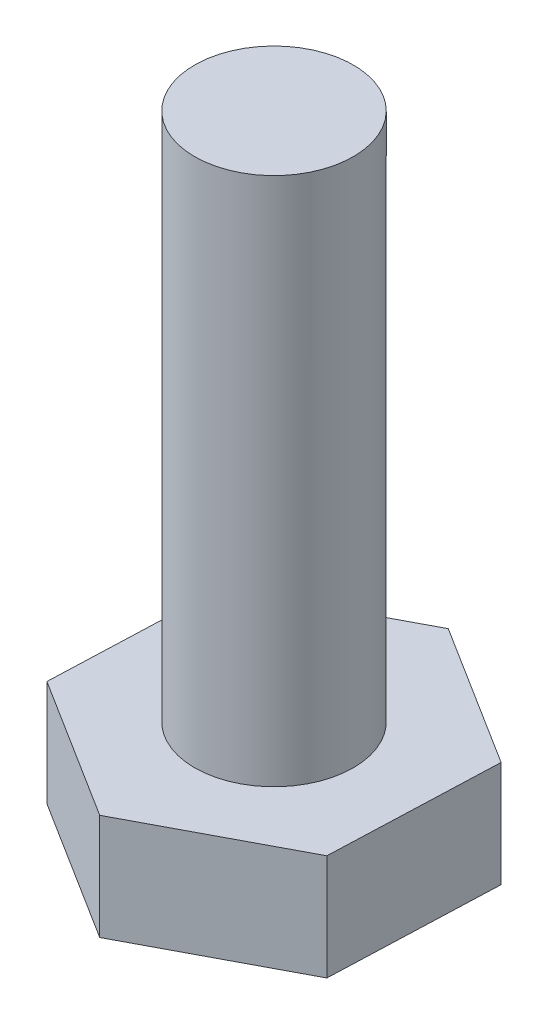
ISO-10303-21;
HEADER;
FILE_DESCRIPTION(('STEP AP214'),'2;1');
FILE_NAME('part.step','',(''),(''),'','','');
FILE_SCHEMA(('AUTOMOTIVE_DESIGN { 1 0 10303 214 1 1 1 1 }'));
ENDSEC;
DATA;
#1=APPLICATION_CONTEXT('core data for automotive mechanical design processes');
#2=APPLICATION_PROTOCOL_DEFINITION('international standard','automotive_design',2000,#1);
#3=PRODUCT_CONTEXT('',#1,'mechanical');
#4=PRODUCT('Part','Part','',(#3));
#5=PRODUCT_RELATED_PRODUCT_CATEGORY('part','',(#4));
#6=PRODUCT_DEFINITION_FORMATION('','',#4);
#7=PRODUCT_DEFINITION_CONTEXT('part definition',#1,'design');
#8=PRODUCT_DEFINITION('design','',#6,#7);
#9=PRODUCT_DEFINITION_SHAPE('','',#8);
#10=(LENGTH_UNIT() NAMED_UNIT(*) SI_UNIT(.MILLI.,.METRE.));
#11=(NAMED_UNIT(*) PLANE_ANGLE_UNIT() SI_UNIT($,.RADIAN.));
#12=(NAMED_UNIT(*) SI_UNIT($,.STERADIAN.) SOLID_ANGLE_UNIT());
#13=UNCERTAINTY_MEASURE_WITH_UNIT(LENGTH_MEASURE(1.E-05),#10,'distance_accuracy_value','');
#14=(GEOMETRIC_REPRESENTATION_CONTEXT(3) GLOBAL_UNCERTAINTY_ASSIGNED_CONTEXT((#13)) GLOBAL_UNIT_ASSIGNED_CONTEXT((#10,
#11,#12)) REPRESENTATION_CONTEXT('',''));
#15=CARTESIAN_POINT('',(0.,0.,0.));
#16=DIRECTION('',(0.,0.,1.));
#17=DIRECTION('',(1.,0.,0.));
#18=AXIS2_PLACEMENT_3D('',#15,#16,#17);
#19=CARTESIAN_POINT('',(-11.2986071500382,-2.,4.06978658909846));
#20=DIRECTION('',(0.,1.,0.));
#21=DIRECTION('',(0.,0.,1.));
#22=AXIS2_PLACEMENT_3D('',#19,#20,#21);
#23=CYLINDRICAL_SURFACE('',#22,1.5);
#24=CARTESIAN_POINT('',(-11.2986071500382,8.,4.06978658909846));
#25=DIRECTION('',(0.,1.,0.));
#26=DIRECTION('',(0.,0.,1.));
#27=AXIS2_PLACEMENT_3D('',#24,#25,#26);
#28=CIRCLE('',#27,1.5);
#29=CARTESIAN_POINT('',(-11.2986071500382,8.,5.56978658909846));
#30=VERTEX_POINT('',#29);
#31=EDGE_CURVE('E11',#30,#30,#28,.T.);
#32=ORIENTED_EDGE('',*,*,#31,.F.);
#33=EDGE_LOOP('',(#32));
#34=FACE_BOUND('',#33,.T.);
#35=CARTESIAN_POINT('',(-11.2986071500382,-2.,4.06978658909845));
#36=DIRECTION('',(0.,-1.,0.));
#37=DIRECTION('',(0.,0.,-1.));
#38=AXIS2_PLACEMENT_3D('',#35,#36,#37);
#39=CIRCLE('',#38,1.49999999999998);
#40=CARTESIAN_POINT('',(-11.2986071500382,-2.,2.56978658909847));
#41=VERTEX_POINT('',#40);
#42=EDGE_CURVE('E121',#41,#41,#39,.T.);
#43=ORIENTED_EDGE('',*,*,#42,.F.);
#44=EDGE_LOOP('',(#43));
#45=FACE_BOUND('',#44,.T.);
#46=ADVANCED_FACE('F32',(#34,#45),#23,.T.);
#47=CARTESIAN_POINT('',(-11.2986071500382,8.,4.06978658909846));
#48=DIRECTION('',(0.,1.,0.));
#49=DIRECTION('',(0.,0.,1.));
#50=AXIS2_PLACEMENT_3D('',#47,#48,#49);
#51=PLANE('',#50);
#52=ORIENTED_EDGE('',*,*,#31,.T.);
#53=EDGE_LOOP('',(#52));
#54=FACE_BOUND('',#53,.T.);
#55=ADVANCED_FACE('F153',(#54),#51,.T.);
#56=CARTESIAN_POINT('',(0.,-2.,0.));
#57=DIRECTION('',(0.,-1.,0.));
#58=DIRECTION('',(0.,0.,-1.));
#59=AXIS2_PLACEMENT_3D('',#56,#57,#58);
#60=PLANE('',#59);
#61=DIRECTION('',(-0.846602483742023,0.,-0.532225736433177));
#62=VECTOR('',#61,1.);
#63=CARTESIAN_POINT('',(-11.4180659525455,-2.,7.24296526793719));
#64=LINE('',#63,#62);
#65=CARTESIAN_POINT('',(-11.4180659525455,-2.,7.24296526793719));
#66=VERTEX_POINT('',#65);
#67=CARTESIAN_POINT('',(-14.1063898979134,-2.,5.55292157084082));
#68=VERTEX_POINT('',#67);
#69=EDGE_CURVE('E117',#66,#68,#64,.T.);
#70=ORIENTED_EDGE('',*,*,#69,.F.);
#71=DIRECTION('',(-0.884222250170024,0.,0.467066389611007));
#72=VECTOR('',#71,1.);
#73=CARTESIAN_POINT('',(-8.61028320467037,-2.,5.75983028619482));
#74=LINE('',#73,#72);
#75=CARTESIAN_POINT('',(-8.61028320467037,-2.,5.75983028619482));
#76=VERTEX_POINT('',#75);
#77=EDGE_CURVE('E77',#76,#66,#74,.T.);
#78=ORIENTED_EDGE('',*,*,#77,.F.);
#79=DIRECTION('',(-0.0376197664280002,0.,0.999292126044183));
#80=VECTOR('',#79,1.);
#81=CARTESIAN_POINT('',(-8.49082440216306,-2.,2.58665160735608));
#82=LINE('',#81,#80);
#83=CARTESIAN_POINT('',(-8.49082440216306,-2.,2.58665160735608));
#84=VERTEX_POINT('',#83);
#85=EDGE_CURVE('E71',#84,#76,#82,.T.);
#86=ORIENTED_EDGE('',*,*,#85,.F.);
#87=DIRECTION('',(0.846602483742023,0.,0.532225736433177));
#88=VECTOR('',#87,1.);
#89=CARTESIAN_POINT('',(-11.1791483475309,-2.,0.896607910259706));
#90=LINE('',#89,#88);
#91=CARTESIAN_POINT('',(-11.1791483475309,-2.,0.896607910259706));
#92=VERTEX_POINT('',#91);
#93=EDGE_CURVE('E107',#92,#84,#90,.T.);
#94=ORIENTED_EDGE('',*,*,#93,.F.);
#95=DIRECTION('',(0.884222250170023,0.,-0.467066389611007));
#96=VECTOR('',#95,1.);
#97=CARTESIAN_POINT('',(-13.986931095406,-2.,2.37974289200208));
#98=LINE('',#97,#96);
#99=CARTESIAN_POINT('',(-13.986931095406,-2.,2.37974289200208));
#100=VERTEX_POINT('',#99);
#101=EDGE_CURVE('E123',#100,#92,#98,.T.);
#102=ORIENTED_EDGE('',*,*,#101,.F.);
#103=DIRECTION('',(0.0376197664280001,0.,-0.999292126044183));
#104=VECTOR('',#103,1.);
#105=CARTESIAN_POINT('',(-14.1063898979134,-2.,5.55292157084082));
#106=LINE('',#105,#104);
#107=EDGE_CURVE('E120',#68,#100,#106,.T.);
#108=ORIENTED_EDGE('',*,*,#107,.F.);
#109=EDGE_LOOP('',(#70,#78,#86,#94,#102,#108));
#110=FACE_BOUND('',#109,.T.);
#111=ORIENTED_EDGE('',*,*,#42,.T.);
#112=EDGE_LOOP('',(#111));
#113=FACE_BOUND('',#112,.T.);
#114=ADVANCED_FACE('F141',(#110,#113),#60,.F.);
#115=CARTESIAN_POINT('',(-11.4180659525455,-4.,7.24296526793719));
#116=DIRECTION('',(0.532225736433177,0.,-0.846602483742023));
#117=DIRECTION('',(-0.846602483742023,0.,-0.532225736433177));
#118=AXIS2_PLACEMENT_3D('',#115,#116,#117);
#119=PLANE('',#118);
#120=ORIENTED_EDGE('',*,*,#69,.T.);
#121=DIRECTION('',(0.,1.,0.));
#122=VECTOR('',#121,1.);
#123=CARTESIAN_POINT('',(-14.1063898979134,-4.,5.55292157084082));
#124=LINE('',#123,#122);
#125=CARTESIAN_POINT('',(-14.1063898979134,-4.,5.55292157084082));
#126=VERTEX_POINT('',#125);
#127=EDGE_CURVE('E40',#126,#68,#124,.T.);
#128=ORIENTED_EDGE('',*,*,#127,.F.);
#129=DIRECTION('',(-0.846602483742023,0.,-0.532225736433177));
#130=VECTOR('',#129,1.);
#131=CARTESIAN_POINT('',(-11.4180659525455,-4.,7.24296526793719));
#132=LINE('',#131,#130);
#133=CARTESIAN_POINT('',(-11.4180659525455,-4.,7.24296526793719));
#134=VERTEX_POINT('',#133);
#135=EDGE_CURVE('E128',#134,#126,#132,.T.);
#136=ORIENTED_EDGE('',*,*,#135,.F.);
#137=DIRECTION('',(0.,1.,0.));
#138=VECTOR('',#137,1.);
#139=CARTESIAN_POINT('',(-11.4180659525455,-4.,7.24296526793719));
#140=LINE('',#139,#138);
#141=EDGE_CURVE('E113',#134,#66,#140,.T.);
#142=ORIENTED_EDGE('',*,*,#141,.T.);
#143=EDGE_LOOP('',(#120,#128,#136,#142));
#144=FACE_BOUND('',#143,.T.);
#145=ADVANCED_FACE('F139',(#144),#119,.F.);
#146=CARTESIAN_POINT('',(-14.1063898979134,-4.,5.55292157084082));
#147=DIRECTION('',(0.999292126044183,0.,0.0376197664280001));
#148=DIRECTION('',(0.0376197664280001,0.,-0.999292126044183));
#149=AXIS2_PLACEMENT_3D('',#146,#147,#148);
#150=PLANE('',#149);
#151=ORIENTED_EDGE('',*,*,#107,.T.);
#152=DIRECTION('',(0.,1.,0.));
#153=VECTOR('',#152,1.);
#154=CARTESIAN_POINT('',(-13.986931095406,-4.,2.37974289200208));
#155=LINE('',#154,#153);
#156=CARTESIAN_POINT('',(-13.986931095406,-4.,2.37974289200208));
#157=VERTEX_POINT('',#156);
#158=EDGE_CURVE('E132',#157,#100,#155,.T.);
#159=ORIENTED_EDGE('',*,*,#158,.F.);
#160=DIRECTION('',(0.0376197664280001,0.,-0.999292126044183));
#161=VECTOR('',#160,1.);
#162=CARTESIAN_POINT('',(-14.1063898979134,-4.,5.55292157084082));
#163=LINE('',#162,#161);
#164=EDGE_CURVE('E86',#126,#157,#163,.T.);
#165=ORIENTED_EDGE('',*,*,#164,.F.);
#166=ORIENTED_EDGE('',*,*,#127,.T.);
#167=EDGE_LOOP('',(#151,#159,#165,#166));
#168=FACE_BOUND('',#167,.T.);
#169=ADVANCED_FACE('F135',(#168),#150,.F.);
#170=CARTESIAN_POINT('',(-13.986931095406,-4.,2.37974289200208));
#171=DIRECTION('',(0.467066389611007,0.,0.884222250170023));
#172=DIRECTION('',(0.884222250170023,0.,-0.467066389611007));
#173=AXIS2_PLACEMENT_3D('',#170,#171,#172);
#174=PLANE('',#173);
#175=ORIENTED_EDGE('',*,*,#101,.T.);
#176=DIRECTION('',(0.,1.,0.));
#177=VECTOR('',#176,1.);
#178=CARTESIAN_POINT('',(-11.1791483475309,-4.,0.896607910259706));
#179=LINE('',#178,#177);
#180=CARTESIAN_POINT('',(-11.1791483475309,-4.,0.896607910259706));
#181=VERTEX_POINT('',#180);
#182=EDGE_CURVE('E108',#181,#92,#179,.T.);
#183=ORIENTED_EDGE('',*,*,#182,.F.);
#184=DIRECTION('',(0.884222250170023,0.,-0.467066389611007));
#185=VECTOR('',#184,1.);
#186=CARTESIAN_POINT('',(-13.986931095406,-4.,2.37974289200208));
#187=LINE('',#186,#185);
#188=EDGE_CURVE('E99',#157,#181,#187,.T.);
#189=ORIENTED_EDGE('',*,*,#188,.F.);
#190=ORIENTED_EDGE('',*,*,#158,.T.);
#191=EDGE_LOOP('',(#175,#183,#189,#190));
#192=FACE_BOUND('',#191,.T.);
#193=ADVANCED_FACE('F145',(#192),#174,.F.);
#194=CARTESIAN_POINT('',(-11.1791483475309,-4.,0.896607910259706));
#195=DIRECTION('',(-0.532225736433177,0.,0.846602483742023));
#196=DIRECTION('',(0.846602483742023,0.,0.532225736433177));
#197=AXIS2_PLACEMENT_3D('',#194,#195,#196);
#198=PLANE('',#197);
#199=ORIENTED_EDGE('',*,*,#93,.T.);
#200=DIRECTION('',(0.,1.,0.));
#201=VECTOR('',#200,1.);
#202=CARTESIAN_POINT('',(-8.49082440216306,-4.,2.58665160735608));
#203=LINE('',#202,#201);
#204=CARTESIAN_POINT('',(-8.49082440216306,-4.,2.58665160735608));
#205=VERTEX_POINT('',#204);
#206=EDGE_CURVE('E104',#205,#84,#203,.T.);
#207=ORIENTED_EDGE('',*,*,#206,.F.);
#208=DIRECTION('',(0.846602483742023,0.,0.532225736433177));
#209=VECTOR('',#208,1.);
#210=CARTESIAN_POINT('',(-11.1791483475309,-4.,0.896607910259706));
#211=LINE('',#210,#209);
#212=EDGE_CURVE('E93',#181,#205,#211,.T.);
#213=ORIENTED_EDGE('',*,*,#212,.F.);
#214=ORIENTED_EDGE('',*,*,#182,.T.);
#215=EDGE_LOOP('',(#199,#207,#213,#214));
#216=FACE_BOUND('',#215,.T.);
#217=ADVANCED_FACE('F105',(#216),#198,.F.);
#218=CARTESIAN_POINT('',(-8.49082440216306,-4.,2.58665160735608));
#219=DIRECTION('',(-0.999292126044183,0.,-0.0376197664280002));
#220=DIRECTION('',(-0.0376197664280002,0.,0.999292126044183));
#221=AXIS2_PLACEMENT_3D('',#218,#219,#220);
#222=PLANE('',#221);
#223=ORIENTED_EDGE('',*,*,#85,.T.);
#224=DIRECTION('',(0.,1.,0.));
#225=VECTOR('',#224,1.);
#226=CARTESIAN_POINT('',(-8.61028320467037,-4.,5.75983028619482));
#227=LINE('',#226,#225);
#228=CARTESIAN_POINT('',(-8.61028320467037,-4.,5.75983028619482));
#229=VERTEX_POINT('',#228);
#230=EDGE_CURVE('E109',#229,#76,#227,.T.);
#231=ORIENTED_EDGE('',*,*,#230,.F.);
#232=DIRECTION('',(-0.0376197664280002,0.,0.999292126044183));
#233=VECTOR('',#232,1.);
#234=CARTESIAN_POINT('',(-8.49082440216306,-4.,2.58665160735608));
#235=LINE('',#234,#233);
#236=EDGE_CURVE('E97',#205,#229,#235,.T.);
#237=ORIENTED_EDGE('',*,*,#236,.F.);
#238=ORIENTED_EDGE('',*,*,#206,.T.);
#239=EDGE_LOOP('',(#223,#231,#237,#238));
#240=FACE_BOUND('',#239,.T.);
#241=ADVANCED_FACE('F111',(#240),#222,.F.);
#242=CARTESIAN_POINT('',(-8.61028320467037,-4.,5.75983028619482));
#243=DIRECTION('',(-0.467066389611007,0.,-0.884222250170024));
#244=DIRECTION('',(-0.884222250170024,0.,0.467066389611007));
#245=AXIS2_PLACEMENT_3D('',#242,#243,#244);
#246=PLANE('',#245);
#247=ORIENTED_EDGE('',*,*,#77,.T.);
#248=ORIENTED_EDGE('',*,*,#141,.F.);
#249=DIRECTION('',(-0.884222250170024,0.,0.467066389611007));
#250=VECTOR('',#249,1.);
#251=CARTESIAN_POINT('',(-8.61028320467037,-4.,5.75983028619482));
#252=LINE('',#251,#250);
#253=EDGE_CURVE('E48',#229,#134,#252,.T.);
#254=ORIENTED_EDGE('',*,*,#253,.F.);
#255=ORIENTED_EDGE('',*,*,#230,.T.);
#256=EDGE_LOOP('',(#247,#248,#254,#255));
#257=FACE_BOUND('',#256,.T.);
#258=ADVANCED_FACE('F167',(#257),#246,.F.);
#259=CARTESIAN_POINT('',(-11.2986071500382,-4.,4.06978658909845));
#260=DIRECTION('',(0.,-1.,0.));
#261=DIRECTION('',(0.,0.,-1.));
#262=AXIS2_PLACEMENT_3D('',#259,#260,#261);
#263=PLANE('',#262);
#264=ORIENTED_EDGE('',*,*,#135,.T.);
#265=ORIENTED_EDGE('',*,*,#164,.T.);
#266=ORIENTED_EDGE('',*,*,#188,.T.);
#267=ORIENTED_EDGE('',*,*,#212,.T.);
#268=ORIENTED_EDGE('',*,*,#236,.T.);
#269=ORIENTED_EDGE('',*,*,#253,.T.);
#270=EDGE_LOOP('',(#264,#265,#266,#267,#268,#269));
#271=FACE_BOUND('',#270,.T.);
#272=ADVANCED_FACE('F95',(#271),#263,.T.);
#273=CLOSED_SHELL('',(#46,#55,#114,#145,#169,#193,#217,#241,#258,#272));
#274=MANIFOLD_SOLID_BREP('B2',#273);
#275=ADVANCED_BREP_SHAPE_REPRESENTATION('',(#18,#274),#14);
#276=SHAPE_DEFINITION_REPRESENTATION(#9,#275);
ENDSEC;
END-ISO-10303-21;
